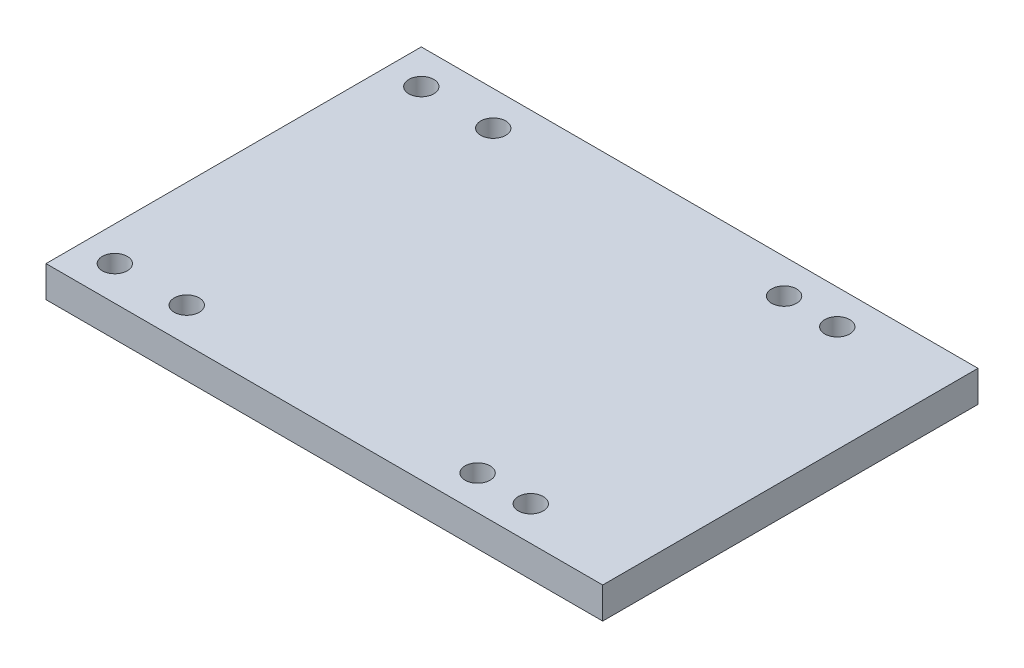
ISO-10303-21;
HEADER;
FILE_DESCRIPTION(('STEP AP214'),'2;1');
FILE_NAME('part.step','',(''),(''),'','','');
FILE_SCHEMA(('AUTOMOTIVE_DESIGN { 1 0 10303 214 1 1 1 1 }'));
ENDSEC;
DATA;
#1=APPLICATION_CONTEXT('core data for automotive mechanical design processes');
#2=APPLICATION_PROTOCOL_DEFINITION('international standard','automotive_design',2000,#1);
#3=PRODUCT_CONTEXT('',#1,'mechanical');
#4=PRODUCT('Part','Part','',(#3));
#5=PRODUCT_RELATED_PRODUCT_CATEGORY('part','',(#4));
#6=PRODUCT_DEFINITION_FORMATION('','',#4);
#7=PRODUCT_DEFINITION_CONTEXT('part definition',#1,'design');
#8=PRODUCT_DEFINITION('design','',#6,#7);
#9=PRODUCT_DEFINITION_SHAPE('','',#8);
#10=(LENGTH_UNIT() NAMED_UNIT(*) SI_UNIT(.MILLI.,.METRE.));
#11=(NAMED_UNIT(*) PLANE_ANGLE_UNIT() SI_UNIT($,.RADIAN.));
#12=(NAMED_UNIT(*) SI_UNIT($,.STERADIAN.) SOLID_ANGLE_UNIT());
#13=UNCERTAINTY_MEASURE_WITH_UNIT(LENGTH_MEASURE(1.E-05),#10,'distance_accuracy_value','');
#14=(GEOMETRIC_REPRESENTATION_CONTEXT(3) GLOBAL_UNCERTAINTY_ASSIGNED_CONTEXT((#13)) GLOBAL_UNIT_ASSIGNED_CONTEXT((#10,
#11,#12)) REPRESENTATION_CONTEXT('',''));
#15=CARTESIAN_POINT('',(0.,0.,0.));
#16=DIRECTION('',(0.,0.,1.));
#17=DIRECTION('',(1.,0.,0.));
#18=AXIS2_PLACEMENT_3D('',#15,#16,#17);
#19=CARTESIAN_POINT('',(0.,5.,0.));
#20=DIRECTION('',(0.,1.,0.));
#21=DIRECTION('',(0.,0.,1.));
#22=AXIS2_PLACEMENT_3D('',#19,#20,#21);
#23=PLANE('',#22);
#24=CARTESIAN_POINT('',(-20.089219330855,5.,33.1263940520447));
#25=DIRECTION('',(0.,1.,0.));
#26=DIRECTION('',(0.,0.,1.));
#27=AXIS2_PLACEMENT_3D('',#24,#25,#26);
#28=CIRCLE('',#27,2.);
#29=CARTESIAN_POINT('',(-20.089219330855,5.,35.1263940520447));
#30=VERTEX_POINT('',#29);
#31=EDGE_CURVE('E174',#30,#30,#28,.T.);
#32=ORIENTED_EDGE('',*,*,#31,.F.);
#33=EDGE_LOOP('',(#32));
#34=FACE_BOUND('',#33,.T.);
#35=CARTESIAN_POINT('',(-20.089219330855,5.,-15.8736059479553));
#36=DIRECTION('',(0.,1.,0.));
#37=DIRECTION('',(0.,0.,1.));
#38=AXIS2_PLACEMENT_3D('',#35,#36,#37);
#39=CIRCLE('',#38,2.);
#40=CARTESIAN_POINT('',(-20.089219330855,5.,-13.8736059479553));
#41=VERTEX_POINT('',#40);
#42=EDGE_CURVE('E158',#41,#41,#39,.T.);
#43=ORIENTED_EDGE('',*,*,#42,.F.);
#44=EDGE_LOOP('',(#43));
#45=FACE_BOUND('',#44,.T.);
#46=CARTESIAN_POINT('',(-31.589219330855,5.,33.1263940520447));
#47=DIRECTION('',(0.,1.,0.));
#48=DIRECTION('',(0.,0.,1.));
#49=AXIS2_PLACEMENT_3D('',#46,#47,#48);
#50=CIRCLE('',#49,2.);
#51=CARTESIAN_POINT('',(-31.589219330855,5.,35.1263940520447));
#52=VERTEX_POINT('',#51);
#53=EDGE_CURVE('E142',#52,#52,#50,.T.);
#54=ORIENTED_EDGE('',*,*,#53,.F.);
#55=EDGE_LOOP('',(#54));
#56=FACE_BOUND('',#55,.T.);
#57=CARTESIAN_POINT('',(-31.589219330855,5.,-15.8736059479553));
#58=DIRECTION('',(0.,1.,0.));
#59=DIRECTION('',(0.,0.,1.));
#60=AXIS2_PLACEMENT_3D('',#57,#58,#59);
#61=CIRCLE('',#60,2.);
#62=CARTESIAN_POINT('',(-31.589219330855,5.,-13.8736059479553));
#63=VERTEX_POINT('',#62);
#64=EDGE_CURVE('E112',#63,#63,#61,.T.);
#65=ORIENTED_EDGE('',*,*,#64,.F.);
#66=EDGE_LOOP('',(#65));
#67=FACE_BOUND('',#66,.T.);
#68=DIRECTION('',(0.,0.,1.));
#69=VECTOR('',#68,1.);
#70=CARTESIAN_POINT('',(-37.089219330855,5.,-21.3736059479553));
#71=LINE('',#70,#69);
#72=CARTESIAN_POINT('',(-37.089219330855,5.,-21.3736059479553));
#73=VERTEX_POINT('',#72);
#74=CARTESIAN_POINT('',(-37.089219330855,5.,38.6263940520447));
#75=VERTEX_POINT('',#74);
#76=EDGE_CURVE('E92',#73,#75,#71,.T.);
#77=ORIENTED_EDGE('',*,*,#76,.T.);
#78=DIRECTION('',(1.,0.,0.));
#79=VECTOR('',#78,1.);
#80=CARTESIAN_POINT('',(-37.089219330855,5.,38.6263940520447));
#81=LINE('',#80,#79);
#82=CARTESIAN_POINT('',(51.910780669145,5.,38.6263940520447));
#83=VERTEX_POINT('',#82);
#84=EDGE_CURVE('E87',#75,#83,#81,.T.);
#85=ORIENTED_EDGE('',*,*,#84,.T.);
#86=DIRECTION('',(0.,0.,-1.));
#87=VECTOR('',#86,1.);
#88=CARTESIAN_POINT('',(51.910780669145,5.,-21.3736059479553));
#89=LINE('',#88,#87);
#90=CARTESIAN_POINT('',(51.910780669145,5.,-21.3736059479553));
#91=VERTEX_POINT('',#90);
#92=EDGE_CURVE('E90',#83,#91,#89,.T.);
#93=ORIENTED_EDGE('',*,*,#92,.T.);
#94=DIRECTION('',(-1.,0.,0.));
#95=VECTOR('',#94,1.);
#96=CARTESIAN_POINT('',(-37.089219330855,5.,-21.3736059479553));
#97=LINE('',#96,#95);
#98=EDGE_CURVE('E57',#91,#73,#97,.T.);
#99=ORIENTED_EDGE('',*,*,#98,.T.);
#100=EDGE_LOOP('',(#77,#85,#93,#99));
#101=FACE_BOUND('',#100,.T.);
#102=CARTESIAN_POINT('',(26.410780669145,5.,-15.8736059479553));
#103=DIRECTION('',(0.,1.,0.));
#104=DIRECTION('',(0.,0.,1.));
#105=AXIS2_PLACEMENT_3D('',#102,#103,#104);
#106=CIRCLE('',#105,2.);
#107=CARTESIAN_POINT('',(26.410780669145,5.,-13.8736059479553));
#108=VERTEX_POINT('',#107);
#109=EDGE_CURVE('E134',#108,#108,#106,.T.);
#110=ORIENTED_EDGE('',*,*,#109,.F.);
#111=EDGE_LOOP('',(#110));
#112=FACE_BOUND('',#111,.T.);
#113=CARTESIAN_POINT('',(26.410780669145,5.,33.1263940520447));
#114=DIRECTION('',(0.,1.,0.));
#115=DIRECTION('',(0.,0.,1.));
#116=AXIS2_PLACEMENT_3D('',#113,#114,#115);
#117=CIRCLE('',#116,2.);
#118=CARTESIAN_POINT('',(26.410780669145,5.,35.1263940520447));
#119=VERTEX_POINT('',#118);
#120=EDGE_CURVE('E150',#119,#119,#117,.T.);
#121=ORIENTED_EDGE('',*,*,#120,.F.);
#122=EDGE_LOOP('',(#121));
#123=FACE_BOUND('',#122,.T.);
#124=CARTESIAN_POINT('',(34.910780669145,5.,-15.8736059479553));
#125=DIRECTION('',(0.,1.,0.));
#126=DIRECTION('',(0.,0.,1.));
#127=AXIS2_PLACEMENT_3D('',#124,#125,#126);
#128=CIRCLE('',#127,2.);
#129=CARTESIAN_POINT('',(34.910780669145,5.,-13.8736059479553));
#130=VERTEX_POINT('',#129);
#131=EDGE_CURVE('E166',#130,#130,#128,.T.);
#132=ORIENTED_EDGE('',*,*,#131,.F.);
#133=EDGE_LOOP('',(#132));
#134=FACE_BOUND('',#133,.T.);
#135=CARTESIAN_POINT('',(34.910780669145,5.,33.1263940520447));
#136=DIRECTION('',(0.,1.,0.));
#137=DIRECTION('',(0.,0.,1.));
#138=AXIS2_PLACEMENT_3D('',#135,#136,#137);
#139=CIRCLE('',#138,2.);
#140=CARTESIAN_POINT('',(34.910780669145,5.,35.1263940520447));
#141=VERTEX_POINT('',#140);
#142=EDGE_CURVE('E182',#141,#141,#139,.T.);
#143=ORIENTED_EDGE('',*,*,#142,.F.);
#144=EDGE_LOOP('',(#143));
#145=FACE_BOUND('',#144,.T.);
#146=ADVANCED_FACE('F39',(#34,#45,#56,#67,#101,#112,#123,#134,#145),#23,.T.);
#147=CARTESIAN_POINT('',(0.,0.,0.));
#148=DIRECTION('',(0.,1.,0.));
#149=DIRECTION('',(0.,0.,1.));
#150=AXIS2_PLACEMENT_3D('',#147,#148,#149);
#151=PLANE('',#150);
#152=DIRECTION('',(0.,0.,1.));
#153=VECTOR('',#152,1.);
#154=CARTESIAN_POINT('',(-37.089219330855,0.,-21.3736059479553));
#155=LINE('',#154,#153);
#156=CARTESIAN_POINT('',(-37.089219330855,0.,-21.3736059479553));
#157=VERTEX_POINT('',#156);
#158=CARTESIAN_POINT('',(-37.089219330855,0.,38.6263940520447));
#159=VERTEX_POINT('',#158);
#160=EDGE_CURVE('E108',#157,#159,#155,.T.);
#161=ORIENTED_EDGE('',*,*,#160,.F.);
#162=DIRECTION('',(-1.,0.,0.));
#163=VECTOR('',#162,1.);
#164=CARTESIAN_POINT('',(-37.089219330855,0.,-21.3736059479553));
#165=LINE('',#164,#163);
#166=CARTESIAN_POINT('',(51.910780669145,0.,-21.3736059479553));
#167=VERTEX_POINT('',#166);
#168=EDGE_CURVE('E80',#167,#157,#165,.T.);
#169=ORIENTED_EDGE('',*,*,#168,.F.);
#170=DIRECTION('',(0.,0.,-1.));
#171=VECTOR('',#170,1.);
#172=CARTESIAN_POINT('',(51.910780669145,0.,-21.3736059479553));
#173=LINE('',#172,#171);
#174=CARTESIAN_POINT('',(51.910780669145,0.,38.6263940520447));
#175=VERTEX_POINT('',#174);
#176=EDGE_CURVE('E74',#175,#167,#173,.T.);
#177=ORIENTED_EDGE('',*,*,#176,.F.);
#178=DIRECTION('',(1.,0.,0.));
#179=VECTOR('',#178,1.);
#180=CARTESIAN_POINT('',(-37.089219330855,0.,38.6263940520447));
#181=LINE('',#180,#179);
#182=EDGE_CURVE('E97',#159,#175,#181,.T.);
#183=ORIENTED_EDGE('',*,*,#182,.F.);
#184=EDGE_LOOP('',(#161,#169,#177,#183));
#185=FACE_BOUND('',#184,.T.);
#186=CARTESIAN_POINT('',(-31.589219330855,0.,-15.8736059479553));
#187=DIRECTION('',(0.,1.,0.));
#188=DIRECTION('',(0.,0.,1.));
#189=AXIS2_PLACEMENT_3D('',#186,#187,#188);
#190=CIRCLE('',#189,2.);
#191=CARTESIAN_POINT('',(-31.589219330855,0.,-13.8736059479553));
#192=VERTEX_POINT('',#191);
#193=EDGE_CURVE('E130',#192,#192,#190,.T.);
#194=ORIENTED_EDGE('',*,*,#193,.T.);
#195=EDGE_LOOP('',(#194));
#196=FACE_BOUND('',#195,.T.);
#197=CARTESIAN_POINT('',(26.410780669145,0.,-15.8736059479553));
#198=DIRECTION('',(0.,1.,0.));
#199=DIRECTION('',(0.,0.,1.));
#200=AXIS2_PLACEMENT_3D('',#197,#198,#199);
#201=CIRCLE('',#200,2.);
#202=CARTESIAN_POINT('',(26.410780669145,0.,-13.8736059479553));
#203=VERTEX_POINT('',#202);
#204=EDGE_CURVE('E138',#203,#203,#201,.T.);
#205=ORIENTED_EDGE('',*,*,#204,.T.);
#206=EDGE_LOOP('',(#205));
#207=FACE_BOUND('',#206,.T.);
#208=CARTESIAN_POINT('',(-31.589219330855,0.,33.1263940520447));
#209=DIRECTION('',(0.,1.,0.));
#210=DIRECTION('',(0.,0.,1.));
#211=AXIS2_PLACEMENT_3D('',#208,#209,#210);
#212=CIRCLE('',#211,2.);
#213=CARTESIAN_POINT('',(-31.589219330855,0.,35.1263940520447));
#214=VERTEX_POINT('',#213);
#215=EDGE_CURVE('E146',#214,#214,#212,.T.);
#216=ORIENTED_EDGE('',*,*,#215,.T.);
#217=EDGE_LOOP('',(#216));
#218=FACE_BOUND('',#217,.T.);
#219=CARTESIAN_POINT('',(26.410780669145,0.,33.1263940520447));
#220=DIRECTION('',(0.,1.,0.));
#221=DIRECTION('',(0.,0.,1.));
#222=AXIS2_PLACEMENT_3D('',#219,#220,#221);
#223=CIRCLE('',#222,2.);
#224=CARTESIAN_POINT('',(26.410780669145,0.,35.1263940520447));
#225=VERTEX_POINT('',#224);
#226=EDGE_CURVE('E154',#225,#225,#223,.T.);
#227=ORIENTED_EDGE('',*,*,#226,.T.);
#228=EDGE_LOOP('',(#227));
#229=FACE_BOUND('',#228,.T.);
#230=CARTESIAN_POINT('',(-20.089219330855,0.,-15.8736059479553));
#231=DIRECTION('',(0.,1.,0.));
#232=DIRECTION('',(0.,0.,1.));
#233=AXIS2_PLACEMENT_3D('',#230,#231,#232);
#234=CIRCLE('',#233,2.);
#235=CARTESIAN_POINT('',(-20.089219330855,0.,-13.8736059479553));
#236=VERTEX_POINT('',#235);
#237=EDGE_CURVE('E162',#236,#236,#234,.T.);
#238=ORIENTED_EDGE('',*,*,#237,.T.);
#239=EDGE_LOOP('',(#238));
#240=FACE_BOUND('',#239,.T.);
#241=CARTESIAN_POINT('',(34.910780669145,0.,-15.8736059479553));
#242=DIRECTION('',(0.,1.,0.));
#243=DIRECTION('',(0.,0.,1.));
#244=AXIS2_PLACEMENT_3D('',#241,#242,#243);
#245=CIRCLE('',#244,2.);
#246=CARTESIAN_POINT('',(34.910780669145,0.,-13.8736059479553));
#247=VERTEX_POINT('',#246);
#248=EDGE_CURVE('E170',#247,#247,#245,.T.);
#249=ORIENTED_EDGE('',*,*,#248,.T.);
#250=EDGE_LOOP('',(#249));
#251=FACE_BOUND('',#250,.T.);
#252=CARTESIAN_POINT('',(-20.089219330855,0.,33.1263940520447));
#253=DIRECTION('',(0.,1.,0.));
#254=DIRECTION('',(0.,0.,1.));
#255=AXIS2_PLACEMENT_3D('',#252,#253,#254);
#256=CIRCLE('',#255,2.);
#257=CARTESIAN_POINT('',(-20.089219330855,0.,35.1263940520447));
#258=VERTEX_POINT('',#257);
#259=EDGE_CURVE('E178',#258,#258,#256,.T.);
#260=ORIENTED_EDGE('',*,*,#259,.T.);
#261=EDGE_LOOP('',(#260));
#262=FACE_BOUND('',#261,.T.);
#263=CARTESIAN_POINT('',(34.910780669145,0.,33.1263940520447));
#264=DIRECTION('',(0.,1.,0.));
#265=DIRECTION('',(0.,0.,1.));
#266=AXIS2_PLACEMENT_3D('',#263,#264,#265);
#267=CIRCLE('',#266,2.);
#268=CARTESIAN_POINT('',(34.910780669145,0.,35.1263940520447));
#269=VERTEX_POINT('',#268);
#270=EDGE_CURVE('E186',#269,#269,#267,.T.);
#271=ORIENTED_EDGE('',*,*,#270,.T.);
#272=EDGE_LOOP('',(#271));
#273=FACE_BOUND('',#272,.T.);
#274=ADVANCED_FACE('F125',(#185,#196,#207,#218,#229,#240,#251,#262,#273),#151,.F.);
#275=CARTESIAN_POINT('',(-37.089219330855,5.,-21.3736059479553));
#276=DIRECTION('',(1.,0.,0.));
#277=DIRECTION('',(0.,0.,-1.));
#278=AXIS2_PLACEMENT_3D('',#275,#276,#277);
#279=PLANE('',#278);
#280=ORIENTED_EDGE('',*,*,#160,.T.);
#281=DIRECTION('',(0.,-1.,0.));
#282=VECTOR('',#281,1.);
#283=CARTESIAN_POINT('',(-37.089219330855,5.,38.6263940520447));
#284=LINE('',#283,#282);
#285=EDGE_CURVE('E11',#75,#159,#284,.T.);
#286=ORIENTED_EDGE('',*,*,#285,.F.);
#287=ORIENTED_EDGE('',*,*,#76,.F.);
#288=DIRECTION('',(0.,-1.,0.));
#289=VECTOR('',#288,1.);
#290=CARTESIAN_POINT('',(-37.089219330855,5.,-21.3736059479553));
#291=LINE('',#290,#289);
#292=EDGE_CURVE('E104',#73,#157,#291,.T.);
#293=ORIENTED_EDGE('',*,*,#292,.T.);
#294=EDGE_LOOP('',(#280,#286,#287,#293));
#295=FACE_BOUND('',#294,.T.);
#296=ADVANCED_FACE('F41',(#295),#279,.F.);
#297=CARTESIAN_POINT('',(-37.089219330855,5.,38.6263940520447));
#298=DIRECTION('',(0.,0.,-1.));
#299=DIRECTION('',(-1.,0.,0.));
#300=AXIS2_PLACEMENT_3D('',#297,#298,#299);
#301=PLANE('',#300);
#302=ORIENTED_EDGE('',*,*,#182,.T.);
#303=DIRECTION('',(0.,-1.,0.));
#304=VECTOR('',#303,1.);
#305=CARTESIAN_POINT('',(51.910780669145,5.,38.6263940520447));
#306=LINE('',#305,#304);
#307=EDGE_CURVE('E49',#83,#175,#306,.T.);
#308=ORIENTED_EDGE('',*,*,#307,.F.);
#309=ORIENTED_EDGE('',*,*,#84,.F.);
#310=ORIENTED_EDGE('',*,*,#285,.T.);
#311=EDGE_LOOP('',(#302,#308,#309,#310));
#312=FACE_BOUND('',#311,.T.);
#313=ADVANCED_FACE('F96',(#312),#301,.F.);
#314=CARTESIAN_POINT('',(51.910780669145,5.,-21.3736059479553));
#315=DIRECTION('',(-1.,0.,0.));
#316=DIRECTION('',(0.,0.,1.));
#317=AXIS2_PLACEMENT_3D('',#314,#315,#316);
#318=PLANE('',#317);
#319=ORIENTED_EDGE('',*,*,#176,.T.);
#320=DIRECTION('',(0.,-1.,0.));
#321=VECTOR('',#320,1.);
#322=CARTESIAN_POINT('',(51.910780669145,5.,-21.3736059479553));
#323=LINE('',#322,#321);
#324=EDGE_CURVE('E99',#91,#167,#323,.T.);
#325=ORIENTED_EDGE('',*,*,#324,.F.);
#326=ORIENTED_EDGE('',*,*,#92,.F.);
#327=ORIENTED_EDGE('',*,*,#307,.T.);
#328=EDGE_LOOP('',(#319,#325,#326,#327));
#329=FACE_BOUND('',#328,.T.);
#330=ADVANCED_FACE('F100',(#329),#318,.F.);
#331=CARTESIAN_POINT('',(-37.089219330855,5.,-21.3736059479553));
#332=DIRECTION('',(0.,0.,1.));
#333=DIRECTION('',(1.,0.,0.));
#334=AXIS2_PLACEMENT_3D('',#331,#332,#333);
#335=PLANE('',#334);
#336=ORIENTED_EDGE('',*,*,#168,.T.);
#337=ORIENTED_EDGE('',*,*,#292,.F.);
#338=ORIENTED_EDGE('',*,*,#98,.F.);
#339=ORIENTED_EDGE('',*,*,#324,.T.);
#340=EDGE_LOOP('',(#336,#337,#338,#339));
#341=FACE_BOUND('',#340,.T.);
#342=ADVANCED_FACE('F122',(#341),#335,.F.);
#343=CARTESIAN_POINT('',(-31.589219330855,5.,-15.8736059479553));
#344=DIRECTION('',(0.,-1.,0.));
#345=DIRECTION('',(0.,0.,-1.));
#346=AXIS2_PLACEMENT_3D('',#343,#344,#345);
#347=CYLINDRICAL_SURFACE('',#346,2.);
#348=ORIENTED_EDGE('',*,*,#64,.T.);
#349=EDGE_LOOP('',(#348));
#350=FACE_BOUND('',#349,.T.);
#351=ORIENTED_EDGE('',*,*,#193,.F.);
#352=EDGE_LOOP('',(#351));
#353=FACE_BOUND('',#352,.T.);
#354=ADVANCED_FACE('F207',(#350,#353),#347,.F.);
#355=CARTESIAN_POINT('',(26.410780669145,5.,-15.8736059479553));
#356=DIRECTION('',(0.,-1.,0.));
#357=DIRECTION('',(0.,0.,-1.));
#358=AXIS2_PLACEMENT_3D('',#355,#356,#357);
#359=CYLINDRICAL_SURFACE('',#358,2.);
#360=ORIENTED_EDGE('',*,*,#109,.T.);
#361=EDGE_LOOP('',(#360));
#362=FACE_BOUND('',#361,.T.);
#363=ORIENTED_EDGE('',*,*,#204,.F.);
#364=EDGE_LOOP('',(#363));
#365=FACE_BOUND('',#364,.T.);
#366=ADVANCED_FACE('F253',(#362,#365),#359,.F.);
#367=CARTESIAN_POINT('',(-31.589219330855,5.,33.1263940520447));
#368=DIRECTION('',(0.,-1.,0.));
#369=DIRECTION('',(0.,0.,-1.));
#370=AXIS2_PLACEMENT_3D('',#367,#368,#369);
#371=CYLINDRICAL_SURFACE('',#370,2.);
#372=ORIENTED_EDGE('',*,*,#53,.T.);
#373=EDGE_LOOP('',(#372));
#374=FACE_BOUND('',#373,.T.);
#375=ORIENTED_EDGE('',*,*,#215,.F.);
#376=EDGE_LOOP('',(#375));
#377=FACE_BOUND('',#376,.T.);
#378=ADVANCED_FACE('F261',(#374,#377),#371,.F.);
#379=CARTESIAN_POINT('',(26.410780669145,5.,33.1263940520447));
#380=DIRECTION('',(0.,-1.,0.));
#381=DIRECTION('',(0.,0.,-1.));
#382=AXIS2_PLACEMENT_3D('',#379,#380,#381);
#383=CYLINDRICAL_SURFACE('',#382,2.);
#384=ORIENTED_EDGE('',*,*,#120,.T.);
#385=EDGE_LOOP('',(#384));
#386=FACE_BOUND('',#385,.T.);
#387=ORIENTED_EDGE('',*,*,#226,.F.);
#388=EDGE_LOOP('',(#387));
#389=FACE_BOUND('',#388,.T.);
#390=ADVANCED_FACE('F269',(#386,#389),#383,.F.);
#391=CARTESIAN_POINT('',(-20.089219330855,5.,-15.8736059479553));
#392=DIRECTION('',(0.,-1.,0.));
#393=DIRECTION('',(0.,0.,-1.));
#394=AXIS2_PLACEMENT_3D('',#391,#392,#393);
#395=CYLINDRICAL_SURFACE('',#394,2.);
#396=ORIENTED_EDGE('',*,*,#42,.T.);
#397=EDGE_LOOP('',(#396));
#398=FACE_BOUND('',#397,.T.);
#399=ORIENTED_EDGE('',*,*,#237,.F.);
#400=EDGE_LOOP('',(#399));
#401=FACE_BOUND('',#400,.T.);
#402=ADVANCED_FACE('F278',(#398,#401),#395,.F.);
#403=CARTESIAN_POINT('',(34.910780669145,5.,-15.8736059479553));
#404=DIRECTION('',(0.,-1.,0.));
#405=DIRECTION('',(0.,0.,-1.));
#406=AXIS2_PLACEMENT_3D('',#403,#404,#405);
#407=CYLINDRICAL_SURFACE('',#406,2.);
#408=ORIENTED_EDGE('',*,*,#131,.T.);
#409=EDGE_LOOP('',(#408));
#410=FACE_BOUND('',#409,.T.);
#411=ORIENTED_EDGE('',*,*,#248,.F.);
#412=EDGE_LOOP('',(#411));
#413=FACE_BOUND('',#412,.T.);
#414=ADVANCED_FACE('F287',(#410,#413),#407,.F.);
#415=CARTESIAN_POINT('',(-20.089219330855,5.,33.1263940520447));
#416=DIRECTION('',(0.,-1.,0.));
#417=DIRECTION('',(0.,0.,-1.));
#418=AXIS2_PLACEMENT_3D('',#415,#416,#417);
#419=CYLINDRICAL_SURFACE('',#418,2.);
#420=ORIENTED_EDGE('',*,*,#31,.T.);
#421=EDGE_LOOP('',(#420));
#422=FACE_BOUND('',#421,.T.);
#423=ORIENTED_EDGE('',*,*,#259,.F.);
#424=EDGE_LOOP('',(#423));
#425=FACE_BOUND('',#424,.T.);
#426=ADVANCED_FACE('F296',(#422,#425),#419,.F.);
#427=CARTESIAN_POINT('',(34.910780669145,5.,33.1263940520447));
#428=DIRECTION('',(0.,-1.,0.));
#429=DIRECTION('',(0.,0.,-1.));
#430=AXIS2_PLACEMENT_3D('',#427,#428,#429);
#431=CYLINDRICAL_SURFACE('',#430,2.);
#432=ORIENTED_EDGE('',*,*,#142,.T.);
#433=EDGE_LOOP('',(#432));
#434=FACE_BOUND('',#433,.T.);
#435=ORIENTED_EDGE('',*,*,#270,.F.);
#436=EDGE_LOOP('',(#435));
#437=FACE_BOUND('',#436,.T.);
#438=ADVANCED_FACE('F194',(#434,#437),#431,.F.);
#439=CLOSED_SHELL('',(#146,#274,#296,#313,#330,#342,#354,#366,#378,#390,#402,#414,#426,#438));
#440=MANIFOLD_SOLID_BREP('B2',#439);
#441=ADVANCED_BREP_SHAPE_REPRESENTATION('',(#18,#440),#14);
#442=SHAPE_DEFINITION_REPRESENTATION(#9,#441);
ENDSEC;
END-ISO-10303-21;
